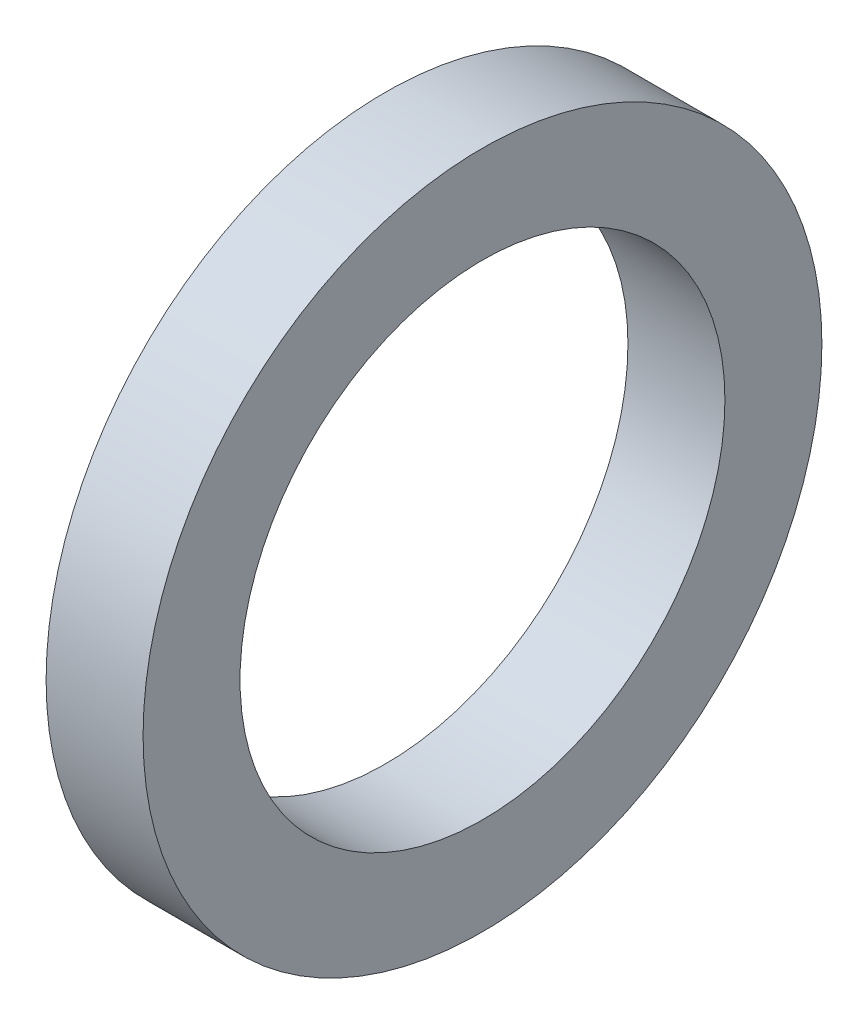
ISO-10303-21;
HEADER;
FILE_DESCRIPTION(('STEP AP214'),'2;1');
FILE_NAME('part.step','',(''),(''),'','','');
FILE_SCHEMA(('AUTOMOTIVE_DESIGN { 1 0 10303 214 1 1 1 1 }'));
ENDSEC;
DATA;
#1=APPLICATION_CONTEXT('core data for automotive mechanical design processes');
#2=APPLICATION_PROTOCOL_DEFINITION('international standard','automotive_design',2000,#1);
#3=PRODUCT_CONTEXT('',#1,'mechanical');
#4=PRODUCT('Part','Part','',(#3));
#5=PRODUCT_RELATED_PRODUCT_CATEGORY('part','',(#4));
#6=PRODUCT_DEFINITION_FORMATION('','',#4);
#7=PRODUCT_DEFINITION_CONTEXT('part definition',#1,'design');
#8=PRODUCT_DEFINITION('design','',#6,#7);
#9=PRODUCT_DEFINITION_SHAPE('','',#8);
#10=(LENGTH_UNIT() NAMED_UNIT(*) SI_UNIT(.MILLI.,.METRE.));
#11=(NAMED_UNIT(*) PLANE_ANGLE_UNIT() SI_UNIT($,.RADIAN.));
#12=(NAMED_UNIT(*) SI_UNIT($,.STERADIAN.) SOLID_ANGLE_UNIT());
#13=UNCERTAINTY_MEASURE_WITH_UNIT(LENGTH_MEASURE(1.E-05),#10,'distance_accuracy_value','');
#14=(GEOMETRIC_REPRESENTATION_CONTEXT(3) GLOBAL_UNCERTAINTY_ASSIGNED_CONTEXT((#13)) GLOBAL_UNIT_ASSIGNED_CONTEXT((#10,
#11,#12)) REPRESENTATION_CONTEXT('',''));
#15=CARTESIAN_POINT('',(0.,0.,0.));
#16=DIRECTION('',(0.,0.,1.));
#17=DIRECTION('',(1.,0.,0.));
#18=AXIS2_PLACEMENT_3D('',#15,#16,#17);
#19=CARTESIAN_POINT('',(3.175,0.,0.));
#20=DIRECTION('',(1.,0.,0.));
#21=DIRECTION('',(0.,0.,-1.));
#22=AXIS2_PLACEMENT_3D('',#19,#20,#21);
#23=PLANE('',#22);
#24=CARTESIAN_POINT('',(3.175,0.,0.));
#25=DIRECTION('',(1.,0.,0.));
#26=DIRECTION('',(0.,0.,-1.));
#27=AXIS2_PLACEMENT_3D('',#24,#25,#26);
#28=CIRCLE('',#27,11.1125);
#29=CARTESIAN_POINT('',(3.175,0.,-11.1125));
#30=VERTEX_POINT('',#29);
#31=EDGE_CURVE('E10',#30,#30,#28,.T.);
#32=ORIENTED_EDGE('',*,*,#31,.T.);
#33=EDGE_LOOP('',(#32));
#34=FACE_BOUND('',#33,.T.);
#35=CARTESIAN_POINT('',(3.175,0.,0.));
#36=DIRECTION('',(1.,0.,0.));
#37=DIRECTION('',(0.,0.,-1.));
#38=AXIS2_PLACEMENT_3D('',#35,#36,#37);
#39=CIRCLE('',#38,7.9375);
#40=CARTESIAN_POINT('',(3.175,0.,-7.9375));
#41=VERTEX_POINT('',#40);
#42=EDGE_CURVE('E42',#41,#41,#39,.T.);
#43=ORIENTED_EDGE('',*,*,#42,.F.);
#44=EDGE_LOOP('',(#43));
#45=FACE_BOUND('',#44,.T.);
#46=ADVANCED_FACE('F31',(#34,#45),#23,.T.);
#47=CARTESIAN_POINT('',(0.,0.,0.));
#48=DIRECTION('',(1.,0.,0.));
#49=DIRECTION('',(0.,0.,-1.));
#50=AXIS2_PLACEMENT_3D('',#47,#48,#49);
#51=PLANE('',#50);
#52=CARTESIAN_POINT('',(0.,0.,0.));
#53=DIRECTION('',(1.,0.,0.));
#54=DIRECTION('',(0.,0.,-1.));
#55=AXIS2_PLACEMENT_3D('',#52,#53,#54);
#56=CIRCLE('',#55,11.1125);
#57=CARTESIAN_POINT('',(0.,0.,-11.1125));
#58=VERTEX_POINT('',#57);
#59=EDGE_CURVE('E35',#58,#58,#56,.T.);
#60=ORIENTED_EDGE('',*,*,#59,.F.);
#61=EDGE_LOOP('',(#60));
#62=FACE_BOUND('',#61,.T.);
#63=CARTESIAN_POINT('',(0.,0.,0.));
#64=DIRECTION('',(1.,0.,0.));
#65=DIRECTION('',(0.,0.,-1.));
#66=AXIS2_PLACEMENT_3D('',#63,#64,#65);
#67=CIRCLE('',#66,7.9375);
#68=CARTESIAN_POINT('',(0.,0.,-7.9375));
#69=VERTEX_POINT('',#68);
#70=EDGE_CURVE('E44',#69,#69,#67,.T.);
#71=ORIENTED_EDGE('',*,*,#70,.T.);
#72=EDGE_LOOP('',(#71));
#73=FACE_BOUND('',#72,.T.);
#74=ADVANCED_FACE('F54',(#62,#73),#51,.F.);
#75=CARTESIAN_POINT('',(3.175,0.,0.));
#76=DIRECTION('',(-1.,0.,0.));
#77=DIRECTION('',(0.,0.,1.));
#78=AXIS2_PLACEMENT_3D('',#75,#76,#77);
#79=CYLINDRICAL_SURFACE('',#78,11.1125);
#80=ORIENTED_EDGE('',*,*,#31,.F.);
#81=EDGE_LOOP('',(#80));
#82=FACE_BOUND('',#81,.T.);
#83=ORIENTED_EDGE('',*,*,#59,.T.);
#84=EDGE_LOOP('',(#83));
#85=FACE_BOUND('',#84,.T.);
#86=ADVANCED_FACE('F33',(#82,#85),#79,.T.);
#87=CARTESIAN_POINT('',(3.175,0.,0.));
#88=DIRECTION('',(-1.,0.,0.));
#89=DIRECTION('',(0.,0.,1.));
#90=AXIS2_PLACEMENT_3D('',#87,#88,#89);
#91=CYLINDRICAL_SURFACE('',#90,7.9375);
#92=ORIENTED_EDGE('',*,*,#42,.T.);
#93=EDGE_LOOP('',(#92));
#94=FACE_BOUND('',#93,.T.);
#95=ORIENTED_EDGE('',*,*,#70,.F.);
#96=EDGE_LOOP('',(#95));
#97=FACE_BOUND('',#96,.T.);
#98=ADVANCED_FACE('F50',(#94,#97),#91,.F.);
#99=CLOSED_SHELL('',(#46,#74,#86,#98));
#100=MANIFOLD_SOLID_BREP('B2',#99);
#101=ADVANCED_BREP_SHAPE_REPRESENTATION('',(#18,#100),#14);
#102=SHAPE_DEFINITION_REPRESENTATION(#9,#101);
ENDSEC;
END-ISO-10303-21;
